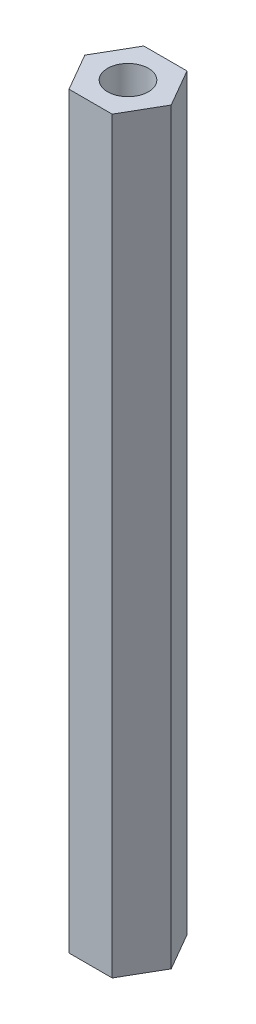
ISO-10303-21;
HEADER;
FILE_DESCRIPTION(('STEP AP214'),'2;1');
FILE_NAME('part.step','',(''),(''),'','','');
FILE_SCHEMA(('AUTOMOTIVE_DESIGN { 1 0 10303 214 1 1 1 1 }'));
ENDSEC;
DATA;
#1=APPLICATION_CONTEXT('core data for automotive mechanical design processes');
#2=APPLICATION_PROTOCOL_DEFINITION('international standard','automotive_design',2000,#1);
#3=PRODUCT_CONTEXT('',#1,'mechanical');
#4=PRODUCT('Part','Part','',(#3));
#5=PRODUCT_RELATED_PRODUCT_CATEGORY('part','',(#4));
#6=PRODUCT_DEFINITION_FORMATION('','',#4);
#7=PRODUCT_DEFINITION_CONTEXT('part definition',#1,'design');
#8=PRODUCT_DEFINITION('design','',#6,#7);
#9=PRODUCT_DEFINITION_SHAPE('','',#8);
#10=(LENGTH_UNIT() NAMED_UNIT(*) SI_UNIT(.MILLI.,.METRE.));
#11=(NAMED_UNIT(*) PLANE_ANGLE_UNIT() SI_UNIT($,.RADIAN.));
#12=(NAMED_UNIT(*) SI_UNIT($,.STERADIAN.) SOLID_ANGLE_UNIT());
#13=UNCERTAINTY_MEASURE_WITH_UNIT(LENGTH_MEASURE(1.E-05),#10,'distance_accuracy_value','');
#14=(GEOMETRIC_REPRESENTATION_CONTEXT(3) GLOBAL_UNCERTAINTY_ASSIGNED_CONTEXT((#13)) GLOBAL_UNIT_ASSIGNED_CONTEXT((#10,
#11,#12)) REPRESENTATION_CONTEXT('',''));
#15=CARTESIAN_POINT('',(0.,0.,0.));
#16=DIRECTION('',(0.,0.,1.));
#17=DIRECTION('',(1.,0.,0.));
#18=AXIS2_PLACEMENT_3D('',#15,#16,#17);
#19=CARTESIAN_POINT('',(1.5877132402715,55.,2.74999999999997));
#20=DIRECTION('',(-0.866025403784441,0.,-0.499999999999995));
#21=DIRECTION('',(-0.499999999999995,0.,0.866025403784442));
#22=AXIS2_PLACEMENT_3D('',#19,#20,#21);
#23=PLANE('',#22);
#24=DIRECTION('',(0.499999999999995,0.,-0.866025403784441));
#25=VECTOR('',#24,1.);
#26=CARTESIAN_POINT('',(1.5877132402715,0.,2.74999999999997));
#27=LINE('',#26,#25);
#28=CARTESIAN_POINT('',(1.5877132402715,0.,2.74999999999997));
#29=VERTEX_POINT('',#28);
#30=CARTESIAN_POINT('',(3.17542648054293,0.,0.));
#31=VERTEX_POINT('',#30);
#32=EDGE_CURVE('E117',#29,#31,#27,.T.);
#33=ORIENTED_EDGE('',*,*,#32,.T.);
#34=DIRECTION('',(0.,-1.,0.));
#35=VECTOR('',#34,1.);
#36=CARTESIAN_POINT('',(3.17542648054293,55.,0.));
#37=LINE('',#36,#35);
#38=CARTESIAN_POINT('',(3.17542648054293,55.,0.));
#39=VERTEX_POINT('',#38);
#40=EDGE_CURVE('E11',#39,#31,#37,.T.);
#41=ORIENTED_EDGE('',*,*,#40,.F.);
#42=DIRECTION('',(0.499999999999995,0.,-0.866025403784441));
#43=VECTOR('',#42,1.);
#44=CARTESIAN_POINT('',(1.5877132402715,55.,2.74999999999997));
#45=LINE('',#44,#43);
#46=CARTESIAN_POINT('',(1.5877132402715,55.,2.74999999999997));
#47=VERTEX_POINT('',#46);
#48=EDGE_CURVE('E128',#47,#39,#45,.T.);
#49=ORIENTED_EDGE('',*,*,#48,.F.);
#50=DIRECTION('',(0.,-1.,0.));
#51=VECTOR('',#50,1.);
#52=CARTESIAN_POINT('',(1.5877132402715,55.,2.74999999999997));
#53=LINE('',#52,#51);
#54=EDGE_CURVE('E113',#47,#29,#53,.T.);
#55=ORIENTED_EDGE('',*,*,#54,.T.);
#56=EDGE_LOOP('',(#33,#41,#49,#55));
#57=FACE_BOUND('',#56,.T.);
#58=ADVANCED_FACE('F33',(#57),#23,.F.);
#59=CARTESIAN_POINT('',(3.17542648054293,55.,0.));
#60=DIRECTION('',(-0.866025403784438,0.,0.500000000000001));
#61=DIRECTION('',(0.500000000000001,0.,0.866025403784438));
#62=AXIS2_PLACEMENT_3D('',#59,#60,#61);
#63=PLANE('',#62);
#64=DIRECTION('',(-0.500000000000001,0.,-0.866025403784438));
#65=VECTOR('',#64,1.);
#66=CARTESIAN_POINT('',(3.17542648054293,0.,0.));
#67=LINE('',#66,#65);
#68=CARTESIAN_POINT('',(1.58771324027146,0.,-2.74999999999999));
#69=VERTEX_POINT('',#68);
#70=EDGE_CURVE('E120',#31,#69,#67,.T.);
#71=ORIENTED_EDGE('',*,*,#70,.T.);
#72=DIRECTION('',(0.,-1.,0.));
#73=VECTOR('',#72,1.);
#74=CARTESIAN_POINT('',(1.58771324027146,55.,-2.74999999999999));
#75=LINE('',#74,#73);
#76=CARTESIAN_POINT('',(1.58771324027146,55.,-2.74999999999999));
#77=VERTEX_POINT('',#76);
#78=EDGE_CURVE('E41',#77,#69,#75,.T.);
#79=ORIENTED_EDGE('',*,*,#78,.F.);
#80=DIRECTION('',(-0.500000000000001,0.,-0.866025403784438));
#81=VECTOR('',#80,1.);
#82=CARTESIAN_POINT('',(3.17542648054293,55.,0.));
#83=LINE('',#82,#81);
#84=EDGE_CURVE('E86',#39,#77,#83,.T.);
#85=ORIENTED_EDGE('',*,*,#84,.F.);
#86=ORIENTED_EDGE('',*,*,#40,.T.);
#87=EDGE_LOOP('',(#71,#79,#85,#86));
#88=FACE_BOUND('',#87,.T.);
#89=ADVANCED_FACE('F153',(#88),#63,.F.);
#90=CARTESIAN_POINT('',(1.58771324027146,55.,-2.74999999999999));
#91=DIRECTION('',(0.,0.,1.));
#92=DIRECTION('',(1.,0.,0.));
#93=AXIS2_PLACEMENT_3D('',#90,#91,#92);
#94=PLANE('',#93);
#95=DIRECTION('',(-1.,0.,0.));
#96=VECTOR('',#95,1.);
#97=CARTESIAN_POINT('',(1.58771324027146,0.,-2.74999999999999));
#98=LINE('',#97,#96);
#99=CARTESIAN_POINT('',(-1.58771324027148,0.,-2.74999999999998));
#100=VERTEX_POINT('',#99);
#101=EDGE_CURVE('E123',#69,#100,#98,.T.);
#102=ORIENTED_EDGE('',*,*,#101,.T.);
#103=DIRECTION('',(0.,-1.,0.));
#104=VECTOR('',#103,1.);
#105=CARTESIAN_POINT('',(-1.58771324027148,55.,-2.74999999999998));
#106=LINE('',#105,#104);
#107=CARTESIAN_POINT('',(-1.58771324027148,55.,-2.74999999999998));
#108=VERTEX_POINT('',#107);
#109=EDGE_CURVE('E108',#108,#100,#106,.T.);
#110=ORIENTED_EDGE('',*,*,#109,.F.);
#111=DIRECTION('',(-1.,0.,0.));
#112=VECTOR('',#111,1.);
#113=CARTESIAN_POINT('',(1.58771324027146,55.,-2.74999999999999));
#114=LINE('',#113,#112);
#115=EDGE_CURVE('E99',#77,#108,#114,.T.);
#116=ORIENTED_EDGE('',*,*,#115,.F.);
#117=ORIENTED_EDGE('',*,*,#78,.T.);
#118=EDGE_LOOP('',(#102,#110,#116,#117));
#119=FACE_BOUND('',#118,.T.);
#120=ADVANCED_FACE('F134',(#119),#94,.F.);
#121=CARTESIAN_POINT('',(-1.58771324027148,55.,-2.74999999999998));
#122=DIRECTION('',(0.866025403784442,0.,0.499999999999995));
#123=DIRECTION('',(0.499999999999995,0.,-0.866025403784442));
#124=AXIS2_PLACEMENT_3D('',#121,#122,#123);
#125=PLANE('',#124);
#126=DIRECTION('',(-0.499999999999995,0.,0.866025403784442));
#127=VECTOR('',#126,1.);
#128=CARTESIAN_POINT('',(-1.58771324027148,0.,-2.74999999999998));
#129=LINE('',#128,#127);
#130=CARTESIAN_POINT('',(-3.17542648054293,0.,0.));
#131=VERTEX_POINT('',#130);
#132=EDGE_CURVE('E107',#100,#131,#129,.T.);
#133=ORIENTED_EDGE('',*,*,#132,.T.);
#134=DIRECTION('',(0.,-1.,0.));
#135=VECTOR('',#134,1.);
#136=CARTESIAN_POINT('',(-3.17542648054293,55.,0.));
#137=LINE('',#136,#135);
#138=CARTESIAN_POINT('',(-3.17542648054293,55.,0.));
#139=VERTEX_POINT('',#138);
#140=EDGE_CURVE('E104',#139,#131,#137,.T.);
#141=ORIENTED_EDGE('',*,*,#140,.F.);
#142=DIRECTION('',(-0.499999999999995,0.,0.866025403784442));
#143=VECTOR('',#142,1.);
#144=CARTESIAN_POINT('',(-1.58771324027148,55.,-2.74999999999998));
#145=LINE('',#144,#143);
#146=EDGE_CURVE('E93',#108,#139,#145,.T.);
#147=ORIENTED_EDGE('',*,*,#146,.F.);
#148=ORIENTED_EDGE('',*,*,#109,.T.);
#149=EDGE_LOOP('',(#133,#141,#147,#148));
#150=FACE_BOUND('',#149,.T.);
#151=ADVANCED_FACE('F105',(#150),#125,.F.);
#152=CARTESIAN_POINT('',(-3.17542648054293,55.,0.));
#153=DIRECTION('',(0.866025403784435,0.,-0.500000000000007));
#154=DIRECTION('',(-0.500000000000007,0.,-0.866025403784435));
#155=AXIS2_PLACEMENT_3D('',#152,#153,#154);
#156=PLANE('',#155);
#157=DIRECTION('',(0.500000000000007,0.,0.866025403784435));
#158=VECTOR('',#157,1.);
#159=CARTESIAN_POINT('',(-3.17542648054293,0.,0.));
#160=LINE('',#159,#158);
#161=CARTESIAN_POINT('',(-1.58771324027144,0.,2.75));
#162=VERTEX_POINT('',#161);
#163=EDGE_CURVE('E72',#131,#162,#160,.T.);
#164=ORIENTED_EDGE('',*,*,#163,.T.);
#165=DIRECTION('',(0.,-1.,0.));
#166=VECTOR('',#165,1.);
#167=CARTESIAN_POINT('',(-1.58771324027144,55.,2.75));
#168=LINE('',#167,#166);
#169=CARTESIAN_POINT('',(-1.58771324027144,55.,2.75));
#170=VERTEX_POINT('',#169);
#171=EDGE_CURVE('E109',#170,#162,#168,.T.);
#172=ORIENTED_EDGE('',*,*,#171,.F.);
#173=DIRECTION('',(0.500000000000007,0.,0.866025403784435));
#174=VECTOR('',#173,1.);
#175=CARTESIAN_POINT('',(-3.17542648054293,55.,0.));
#176=LINE('',#175,#174);
#177=EDGE_CURVE('E97',#139,#170,#176,.T.);
#178=ORIENTED_EDGE('',*,*,#177,.F.);
#179=ORIENTED_EDGE('',*,*,#140,.T.);
#180=EDGE_LOOP('',(#164,#172,#178,#179));
#181=FACE_BOUND('',#180,.T.);
#182=ADVANCED_FACE('F111',(#181),#156,.F.);
#183=CARTESIAN_POINT('',(-1.58771324027144,55.,2.75));
#184=DIRECTION('',(0.,0.,-1.));
#185=DIRECTION('',(-1.,0.,0.));
#186=AXIS2_PLACEMENT_3D('',#183,#184,#185);
#187=PLANE('',#186);
#188=DIRECTION('',(1.,0.,0.));
#189=VECTOR('',#188,1.);
#190=CARTESIAN_POINT('',(-1.58771324027144,0.,2.75));
#191=LINE('',#190,#189);
#192=EDGE_CURVE('E78',#162,#29,#191,.T.);
#193=ORIENTED_EDGE('',*,*,#192,.T.);
#194=ORIENTED_EDGE('',*,*,#54,.F.);
#195=DIRECTION('',(1.,0.,0.));
#196=VECTOR('',#195,1.);
#197=CARTESIAN_POINT('',(-1.58771324027144,55.,2.75));
#198=LINE('',#197,#196);
#199=EDGE_CURVE('E49',#170,#47,#198,.T.);
#200=ORIENTED_EDGE('',*,*,#199,.F.);
#201=ORIENTED_EDGE('',*,*,#171,.T.);
#202=EDGE_LOOP('',(#193,#194,#200,#201));
#203=FACE_BOUND('',#202,.T.);
#204=ADVANCED_FACE('F141',(#203),#187,.F.);
#205=CARTESIAN_POINT('',(0.,55.,0.));
#206=DIRECTION('',(0.,1.,0.));
#207=DIRECTION('',(0.,0.,1.));
#208=AXIS2_PLACEMENT_3D('',#205,#206,#207);
#209=PLANE('',#208);
#210=CARTESIAN_POINT('',(0.,55.,0.));
#211=DIRECTION('',(0.,1.,0.));
#212=DIRECTION('',(0.,0.,1.));
#213=AXIS2_PLACEMENT_3D('',#210,#211,#212);
#214=CIRCLE('',#213,1.5);
#215=CARTESIAN_POINT('',(0.,55.,1.5));
#216=VERTEX_POINT('',#215);
#217=EDGE_CURVE('E236',#216,#216,#214,.T.);
#218=ORIENTED_EDGE('',*,*,#217,.F.);
#219=EDGE_LOOP('',(#218));
#220=FACE_BOUND('',#219,.T.);
#221=ORIENTED_EDGE('',*,*,#48,.T.);
#222=ORIENTED_EDGE('',*,*,#84,.T.);
#223=ORIENTED_EDGE('',*,*,#115,.T.);
#224=ORIENTED_EDGE('',*,*,#146,.T.);
#225=ORIENTED_EDGE('',*,*,#177,.T.);
#226=ORIENTED_EDGE('',*,*,#199,.T.);
#227=EDGE_LOOP('',(#221,#222,#223,#224,#225,#226));
#228=FACE_BOUND('',#227,.T.);
#229=ADVANCED_FACE('F95',(#220,#228),#209,.T.);
#230=CARTESIAN_POINT('',(0.,0.,0.));
#231=DIRECTION('',(0.,1.,0.));
#232=DIRECTION('',(0.,0.,1.));
#233=AXIS2_PLACEMENT_3D('',#230,#231,#232);
#234=PLANE('',#233);
#235=CARTESIAN_POINT('',(0.,0.,0.));
#236=DIRECTION('',(0.,1.,0.));
#237=DIRECTION('',(0.,0.,1.));
#238=AXIS2_PLACEMENT_3D('',#235,#236,#237);
#239=CIRCLE('',#238,1.5);
#240=CARTESIAN_POINT('',(0.,0.,1.5));
#241=VERTEX_POINT('',#240);
#242=EDGE_CURVE('E237',#241,#241,#239,.T.);
#243=ORIENTED_EDGE('',*,*,#242,.T.);
#244=EDGE_LOOP('',(#243));
#245=FACE_BOUND('',#244,.T.);
#246=ORIENTED_EDGE('',*,*,#32,.F.);
#247=ORIENTED_EDGE('',*,*,#192,.F.);
#248=ORIENTED_EDGE('',*,*,#163,.F.);
#249=ORIENTED_EDGE('',*,*,#132,.F.);
#250=ORIENTED_EDGE('',*,*,#101,.F.);
#251=ORIENTED_EDGE('',*,*,#70,.F.);
#252=EDGE_LOOP('',(#246,#247,#248,#249,#250,#251));
#253=FACE_BOUND('',#252,.T.);
#254=ADVANCED_FACE('F137',(#245,#253),#234,.F.);
#255=CARTESIAN_POINT('',(0.,45.,0.));
#256=DIRECTION('',(0.,1.,0.));
#257=DIRECTION('',(0.,0.,1.));
#258=AXIS2_PLACEMENT_3D('',#255,#256,#257);
#259=CYLINDRICAL_SURFACE('',#258,1.5);
#260=CARTESIAN_POINT('',(0.,45.,0.));
#261=DIRECTION('',(0.,1.,0.));
#262=DIRECTION('',(0.,0.,1.));
#263=AXIS2_PLACEMENT_3D('',#260,#261,#262);
#264=CIRCLE('',#263,1.5);
#265=CARTESIAN_POINT('',(0.,45.,1.5));
#266=VERTEX_POINT('',#265);
#267=EDGE_CURVE('E121',#266,#266,#264,.T.);
#268=ORIENTED_EDGE('',*,*,#267,.F.);
#269=EDGE_LOOP('',(#268));
#270=FACE_BOUND('',#269,.T.);
#271=ORIENTED_EDGE('',*,*,#217,.T.);
#272=EDGE_LOOP('',(#271));
#273=FACE_BOUND('',#272,.T.);
#274=ADVANCED_FACE('F188',(#270,#273),#259,.F.);
#275=CARTESIAN_POINT('',(0.,45.,0.));
#276=DIRECTION('',(0.,1.,0.));
#277=DIRECTION('',(0.,0.,1.));
#278=AXIS2_PLACEMENT_3D('',#275,#276,#277);
#279=PLANE('',#278);
#280=ORIENTED_EDGE('',*,*,#267,.T.);
#281=EDGE_LOOP('',(#280));
#282=FACE_BOUND('',#281,.T.);
#283=ADVANCED_FACE('F193',(#282),#279,.T.);
#284=CARTESIAN_POINT('',(0.,10.,0.));
#285=DIRECTION('',(0.,-1.,0.));
#286=DIRECTION('',(0.,0.,-1.));
#287=AXIS2_PLACEMENT_3D('',#284,#285,#286);
#288=CYLINDRICAL_SURFACE('',#287,1.5);
#289=CARTESIAN_POINT('',(0.,10.,0.));
#290=DIRECTION('',(0.,1.,0.));
#291=DIRECTION('',(0.,0.,1.));
#292=AXIS2_PLACEMENT_3D('',#289,#290,#291);
#293=CIRCLE('',#292,1.5);
#294=CARTESIAN_POINT('',(0.,10.,1.5));
#295=VERTEX_POINT('',#294);
#296=EDGE_CURVE('E235',#295,#295,#293,.T.);
#297=ORIENTED_EDGE('',*,*,#296,.T.);
#298=EDGE_LOOP('',(#297));
#299=FACE_BOUND('',#298,.T.);
#300=ORIENTED_EDGE('',*,*,#242,.F.);
#301=EDGE_LOOP('',(#300));
#302=FACE_BOUND('',#301,.T.);
#303=ADVANCED_FACE('F203',(#299,#302),#288,.F.);
#304=CARTESIAN_POINT('',(0.,10.,0.));
#305=DIRECTION('',(0.,-1.,0.));
#306=DIRECTION('',(0.,0.,1.));
#307=AXIS2_PLACEMENT_3D('',#304,#305,#306);
#308=PLANE('',#307);
#309=ORIENTED_EDGE('',*,*,#296,.F.);
#310=EDGE_LOOP('',(#309));
#311=FACE_BOUND('',#310,.T.);
#312=ADVANCED_FACE('F219',(#311),#308,.T.);
#313=CLOSED_SHELL('',(#58,#89,#120,#151,#182,#204,#229,#254,#274,#283,#303,#312));
#314=MANIFOLD_SOLID_BREP('B2',#313);
#315=ADVANCED_BREP_SHAPE_REPRESENTATION('',(#18,#314),#14);
#316=SHAPE_DEFINITION_REPRESENTATION(#9,#315);
ENDSEC;
END-ISO-10303-21;
